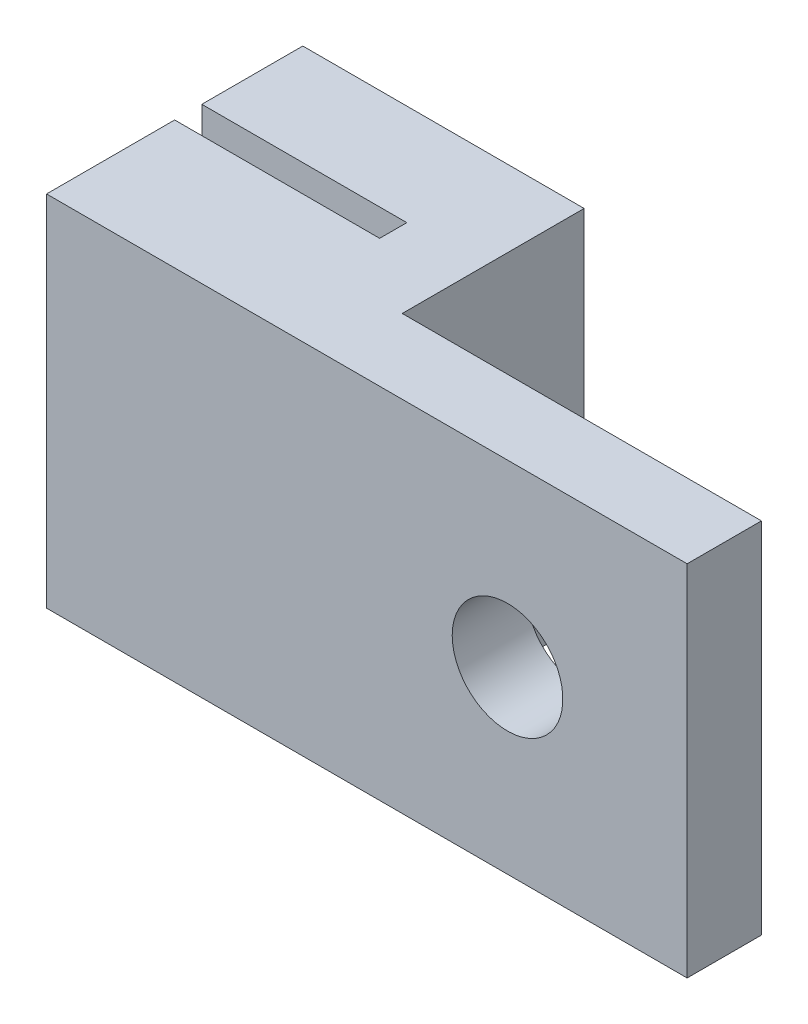
ISO-10303-21;
HEADER;
FILE_DESCRIPTION(('STEP AP214'),'2;1');
FILE_NAME('part.step','',(''),(''),'','','');
FILE_SCHEMA(('AUTOMOTIVE_DESIGN { 1 0 10303 214 1 1 1 1 }'));
ENDSEC;
DATA;
#1=APPLICATION_CONTEXT('core data for automotive mechanical design processes');
#2=APPLICATION_PROTOCOL_DEFINITION('international standard','automotive_design',2000,#1);
#3=PRODUCT_CONTEXT('',#1,'mechanical');
#4=PRODUCT('Part','Part','',(#3));
#5=PRODUCT_RELATED_PRODUCT_CATEGORY('part','',(#4));
#6=PRODUCT_DEFINITION_FORMATION('','',#4);
#7=PRODUCT_DEFINITION_CONTEXT('part definition',#1,'design');
#8=PRODUCT_DEFINITION('design','',#6,#7);
#9=PRODUCT_DEFINITION_SHAPE('','',#8);
#10=(LENGTH_UNIT() NAMED_UNIT(*) SI_UNIT(.MILLI.,.METRE.));
#11=(NAMED_UNIT(*) PLANE_ANGLE_UNIT() SI_UNIT($,.RADIAN.));
#12=(NAMED_UNIT(*) SI_UNIT($,.STERADIAN.) SOLID_ANGLE_UNIT());
#13=UNCERTAINTY_MEASURE_WITH_UNIT(LENGTH_MEASURE(1.E-05),#10,'distance_accuracy_value','');
#14=(GEOMETRIC_REPRESENTATION_CONTEXT(3) GLOBAL_UNCERTAINTY_ASSIGNED_CONTEXT((#13)) GLOBAL_UNIT_ASSIGNED_CONTEXT((#10,
#11,#12)) REPRESENTATION_CONTEXT('',''));
#15=CARTESIAN_POINT('',(0.,0.,0.));
#16=DIRECTION('',(0.,0.,1.));
#17=DIRECTION('',(1.,0.,0.));
#18=AXIS2_PLACEMENT_3D('',#15,#16,#17);
#19=CARTESIAN_POINT('',(0.,-14.,391.676417727354));
#20=DIRECTION('',(0.,0.,1.));
#21=DIRECTION('',(1.,0.,0.));
#22=AXIS2_PLACEMENT_3D('',#19,#20,#21);
#23=PLANE('',#22);
#24=DIRECTION('',(1.,0.,0.));
#25=VECTOR('',#24,1.);
#26=CARTESIAN_POINT('',(0.,0.,391.676417727354));
#27=LINE('',#26,#25);
#28=CARTESIAN_POINT('',(-1237.71012145749,0.,391.676417727354));
#29=VERTEX_POINT('',#28);
#30=CARTESIAN_POINT('',(-1229.71012145749,0.,391.676417727354));
#31=VERTEX_POINT('',#30);
#32=EDGE_CURVE('E141',#29,#31,#27,.T.);
#33=ORIENTED_EDGE('',*,*,#32,.F.);
#34=DIRECTION('',(0.,1.,0.));
#35=VECTOR('',#34,1.);
#36=CARTESIAN_POINT('',(-1237.71012145749,-14.,391.676417727354));
#37=LINE('',#36,#35);
#38=CARTESIAN_POINT('',(-1237.71012145749,-14.,391.676417727354));
#39=VERTEX_POINT('',#38);
#40=EDGE_CURVE('E11',#39,#29,#37,.T.);
#41=ORIENTED_EDGE('',*,*,#40,.F.);
#42=DIRECTION('',(1.,0.,0.));
#43=VECTOR('',#42,1.);
#44=CARTESIAN_POINT('',(0.,-14.,391.676417727354));
#45=LINE('',#44,#43);
#46=CARTESIAN_POINT('',(-1229.71012145749,-14.,391.676417727354));
#47=VERTEX_POINT('',#46);
#48=EDGE_CURVE('E170',#39,#47,#45,.T.);
#49=ORIENTED_EDGE('',*,*,#48,.T.);
#50=DIRECTION('',(0.,1.,0.));
#51=VECTOR('',#50,1.);
#52=CARTESIAN_POINT('',(-1229.71012145749,-14.,391.676417727354));
#53=LINE('',#52,#51);
#54=EDGE_CURVE('E35',#47,#31,#53,.T.);
#55=ORIENTED_EDGE('',*,*,#54,.T.);
#56=EDGE_LOOP('',(#33,#41,#49,#55));
#57=FACE_BOUND('',#56,.T.);
#58=ADVANCED_FACE('F32',(#57),#23,.T.);
#59=CARTESIAN_POINT('',(-1237.71012145749,-14.,0.));
#60=DIRECTION('',(1.,0.,0.));
#61=DIRECTION('',(0.,0.,-1.));
#62=AXIS2_PLACEMENT_3D('',#59,#60,#61);
#63=PLANE('',#62);
#64=DIRECTION('',(0.,0.,-1.));
#65=VECTOR('',#64,1.);
#66=CARTESIAN_POINT('',(-1237.71012145749,0.,0.));
#67=LINE('',#66,#65);
#68=CARTESIAN_POINT('',(-1237.71012145749,0.,387.736417727354));
#69=VERTEX_POINT('',#68);
#70=EDGE_CURVE('E154',#29,#69,#67,.T.);
#71=ORIENTED_EDGE('',*,*,#70,.T.);
#72=DIRECTION('',(0.,1.,0.));
#73=VECTOR('',#72,1.);
#74=CARTESIAN_POINT('',(-1237.71012145749,-14.,387.736417727354));
#75=LINE('',#74,#73);
#76=CARTESIAN_POINT('',(-1237.71012145749,-14.,387.736417727354));
#77=VERTEX_POINT('',#76);
#78=EDGE_CURVE('E40',#77,#69,#75,.T.);
#79=ORIENTED_EDGE('',*,*,#78,.F.);
#80=DIRECTION('',(0.,0.,-1.));
#81=VECTOR('',#80,1.);
#82=CARTESIAN_POINT('',(-1237.71012145749,-14.,0.));
#83=LINE('',#82,#81);
#84=EDGE_CURVE('E137',#39,#77,#83,.T.);
#85=ORIENTED_EDGE('',*,*,#84,.F.);
#86=ORIENTED_EDGE('',*,*,#40,.T.);
#87=EDGE_LOOP('',(#71,#79,#85,#86));
#88=FACE_BOUND('',#87,.T.);
#89=ADVANCED_FACE('F171',(#88),#63,.F.);
#90=CARTESIAN_POINT('',(0.,-14.,387.736417727354));
#91=DIRECTION('',(0.,0.,1.));
#92=DIRECTION('',(1.,0.,0.));
#93=AXIS2_PLACEMENT_3D('',#90,#91,#92);
#94=PLANE('',#93);
#95=DIRECTION('',(1.,0.,0.));
#96=VECTOR('',#95,1.);
#97=CARTESIAN_POINT('',(0.,0.,387.736417727354));
#98=LINE('',#97,#96);
#99=CARTESIAN_POINT('',(-1226.72982017208,0.,387.736417727354));
#100=VERTEX_POINT('',#99);
#101=EDGE_CURVE('E157',#69,#100,#98,.T.);
#102=ORIENTED_EDGE('',*,*,#101,.T.);
#103=DIRECTION('',(0.,1.,0.));
#104=VECTOR('',#103,1.);
#105=CARTESIAN_POINT('',(-1226.72982017208,-14.,387.736417727354));
#106=LINE('',#105,#104);
#107=CARTESIAN_POINT('',(-1226.72982017208,-14.,387.736417727354));
#108=VERTEX_POINT('',#107);
#109=EDGE_CURVE('E145',#108,#100,#106,.T.);
#110=ORIENTED_EDGE('',*,*,#109,.F.);
#111=DIRECTION('',(1.,0.,0.));
#112=VECTOR('',#111,1.);
#113=CARTESIAN_POINT('',(0.,-14.,387.736417727354));
#114=LINE('',#113,#112);
#115=EDGE_CURVE('E129',#77,#108,#114,.T.);
#116=ORIENTED_EDGE('',*,*,#115,.F.);
#117=ORIENTED_EDGE('',*,*,#78,.T.);
#118=EDGE_LOOP('',(#102,#110,#116,#117));
#119=FACE_BOUND('',#118,.T.);
#120=ADVANCED_FACE('F175',(#119),#94,.F.);
#121=CARTESIAN_POINT('',(-1212.71012145749,-14.,0.));
#122=DIRECTION('',(1.,0.,0.));
#123=DIRECTION('',(0.,0.,-1.));
#124=AXIS2_PLACEMENT_3D('',#121,#122,#123);
#125=PLANE('',#124);
#126=DIRECTION('',(0.,1.,0.));
#127=VECTOR('',#126,1.);
#128=CARTESIAN_POINT('',(-1212.71012145749,-14.,394.836001477778));
#129=LINE('',#128,#127);
#130=CARTESIAN_POINT('',(-1212.71012145749,-14.,394.836001477778));
#131=VERTEX_POINT('',#130);
#132=CARTESIAN_POINT('',(-1212.71012145749,0.,394.836001477778));
#133=VERTEX_POINT('',#132);
#134=EDGE_CURVE('E178',#131,#133,#129,.T.);
#135=ORIENTED_EDGE('',*,*,#134,.T.);
#136=DIRECTION('',(0.,0.,-1.));
#137=VECTOR('',#136,1.);
#138=CARTESIAN_POINT('',(-1212.71012145749,0.,0.));
#139=LINE('',#138,#137);
#140=CARTESIAN_POINT('',(-1212.71012145749,0.,397.736417727354));
#141=VERTEX_POINT('',#140);
#142=EDGE_CURVE('E113',#141,#133,#139,.T.);
#143=ORIENTED_EDGE('',*,*,#142,.F.);
#144=DIRECTION('',(0.,1.,0.));
#145=VECTOR('',#144,1.);
#146=CARTESIAN_POINT('',(-1212.71012145749,-14.,397.736417727354));
#147=LINE('',#146,#145);
#148=CARTESIAN_POINT('',(-1212.71012145749,-14.,397.736417727354));
#149=VERTEX_POINT('',#148);
#150=EDGE_CURVE('E106',#149,#141,#147,.T.);
#151=ORIENTED_EDGE('',*,*,#150,.F.);
#152=DIRECTION('',(0.,0.,-1.));
#153=VECTOR('',#152,1.);
#154=CARTESIAN_POINT('',(-1212.71012145749,-14.,0.));
#155=LINE('',#154,#153);
#156=EDGE_CURVE('E111',#149,#131,#155,.T.);
#157=ORIENTED_EDGE('',*,*,#156,.T.);
#158=EDGE_LOOP('',(#135,#143,#151,#157));
#159=FACE_BOUND('',#158,.T.);
#160=ADVANCED_FACE('F109',(#159),#125,.T.);
#161=CARTESIAN_POINT('',(0.,-14.,397.736417727354));
#162=DIRECTION('',(0.,0.,1.));
#163=DIRECTION('',(1.,0.,0.));
#164=AXIS2_PLACEMENT_3D('',#161,#162,#163);
#165=PLANE('',#164);
#166=CARTESIAN_POINT('',(-1219.71997081479,-7.,397.736417727354));
#167=DIRECTION('',(0.,0.,-1.));
#168=DIRECTION('',(-1.,0.,0.));
#169=AXIS2_PLACEMENT_3D('',#166,#167,#168);
#170=CIRCLE('',#169,2.15899999999997);
#171=CARTESIAN_POINT('',(-1221.87897081479,-7.,397.736417727354));
#172=VERTEX_POINT('',#171);
#173=EDGE_CURVE('E214',#172,#172,#170,.T.);
#174=ORIENTED_EDGE('',*,*,#173,.T.);
#175=EDGE_LOOP('',(#174));
#176=FACE_BOUND('',#175,.T.);
#177=DIRECTION('',(1.,0.,0.));
#178=VECTOR('',#177,1.);
#179=CARTESIAN_POINT('',(0.,0.,397.736417727354));
#180=LINE('',#179,#178);
#181=CARTESIAN_POINT('',(-1237.71012145749,0.,397.736417727354));
#182=VERTEX_POINT('',#181);
#183=EDGE_CURVE('E153',#182,#141,#180,.T.);
#184=ORIENTED_EDGE('',*,*,#183,.F.);
#185=DIRECTION('',(0.,1.,0.));
#186=VECTOR('',#185,1.);
#187=CARTESIAN_POINT('',(-1237.71012145749,-14.,397.736417727354));
#188=LINE('',#187,#186);
#189=CARTESIAN_POINT('',(-1237.71012145749,-14.,397.736417727354));
#190=VERTEX_POINT('',#189);
#191=EDGE_CURVE('E118',#190,#182,#188,.T.);
#192=ORIENTED_EDGE('',*,*,#191,.F.);
#193=DIRECTION('',(1.,0.,0.));
#194=VECTOR('',#193,1.);
#195=CARTESIAN_POINT('',(0.,-14.,397.736417727354));
#196=LINE('',#195,#194);
#197=EDGE_CURVE('E125',#190,#149,#196,.T.);
#198=ORIENTED_EDGE('',*,*,#197,.T.);
#199=ORIENTED_EDGE('',*,*,#150,.T.);
#200=EDGE_LOOP('',(#184,#192,#198,#199));
#201=FACE_BOUND('',#200,.T.);
#202=ADVANCED_FACE('F131',(#176,#201),#165,.T.);
#203=CARTESIAN_POINT('',(-1237.71012145749,0.,392.736417727354));
#204=VERTEX_POINT('',#203);
#205=EDGE_CURVE('E151',#182,#204,#67,.T.);
#206=ORIENTED_EDGE('',*,*,#205,.T.);
#207=DIRECTION('',(0.,1.,0.));
#208=VECTOR('',#207,1.);
#209=CARTESIAN_POINT('',(-1237.71012145749,-14.,392.736417727354));
#210=LINE('',#209,#208);
#211=CARTESIAN_POINT('',(-1237.71012145749,-14.,392.736417727354));
#212=VERTEX_POINT('',#211);
#213=EDGE_CURVE('E163',#212,#204,#210,.T.);
#214=ORIENTED_EDGE('',*,*,#213,.F.);
#215=EDGE_CURVE('E133',#190,#212,#83,.T.);
#216=ORIENTED_EDGE('',*,*,#215,.F.);
#217=ORIENTED_EDGE('',*,*,#191,.T.);
#218=EDGE_LOOP('',(#206,#214,#216,#217));
#219=FACE_BOUND('',#218,.T.);
#220=ADVANCED_FACE('F202',(#219),#63,.F.);
#221=CARTESIAN_POINT('',(0.,-14.,392.736417727354));
#222=DIRECTION('',(0.,0.,1.));
#223=DIRECTION('',(1.,0.,0.));
#224=AXIS2_PLACEMENT_3D('',#221,#222,#223);
#225=PLANE('',#224);
#226=DIRECTION('',(1.,0.,0.));
#227=VECTOR('',#226,1.);
#228=CARTESIAN_POINT('',(0.,0.,392.736417727354));
#229=LINE('',#228,#227);
#230=CARTESIAN_POINT('',(-1229.71012145749,0.,392.736417727354));
#231=VERTEX_POINT('',#230);
#232=EDGE_CURVE('E148',#204,#231,#229,.T.);
#233=ORIENTED_EDGE('',*,*,#232,.T.);
#234=DIRECTION('',(0.,1.,0.));
#235=VECTOR('',#234,1.);
#236=CARTESIAN_POINT('',(-1229.71012145749,-14.,392.736417727354));
#237=LINE('',#236,#235);
#238=CARTESIAN_POINT('',(-1229.71012145749,-14.,392.736417727354));
#239=VERTEX_POINT('',#238);
#240=EDGE_CURVE('E165',#239,#231,#237,.T.);
#241=ORIENTED_EDGE('',*,*,#240,.F.);
#242=DIRECTION('',(1.,0.,0.));
#243=VECTOR('',#242,1.);
#244=CARTESIAN_POINT('',(0.,-14.,392.736417727354));
#245=LINE('',#244,#243);
#246=EDGE_CURVE('E135',#212,#239,#245,.T.);
#247=ORIENTED_EDGE('',*,*,#246,.F.);
#248=ORIENTED_EDGE('',*,*,#213,.T.);
#249=EDGE_LOOP('',(#233,#241,#247,#248));
#250=FACE_BOUND('',#249,.T.);
#251=ADVANCED_FACE('F192',(#250),#225,.F.);
#252=CARTESIAN_POINT('',(-1229.71012145749,-14.,0.));
#253=DIRECTION('',(-1.,0.,0.));
#254=DIRECTION('',(0.,0.,1.));
#255=AXIS2_PLACEMENT_3D('',#252,#253,#254);
#256=PLANE('',#255);
#257=DIRECTION('',(0.,0.,1.));
#258=VECTOR('',#257,1.);
#259=CARTESIAN_POINT('',(-1229.71012145749,0.,0.));
#260=LINE('',#259,#258);
#261=EDGE_CURVE('E144',#31,#231,#260,.T.);
#262=ORIENTED_EDGE('',*,*,#261,.F.);
#263=ORIENTED_EDGE('',*,*,#54,.F.);
#264=DIRECTION('',(0.,0.,1.));
#265=VECTOR('',#264,1.);
#266=CARTESIAN_POINT('',(-1229.71012145749,-14.,0.));
#267=LINE('',#266,#265);
#268=EDGE_CURVE('E188',#47,#239,#267,.T.);
#269=ORIENTED_EDGE('',*,*,#268,.T.);
#270=ORIENTED_EDGE('',*,*,#240,.T.);
#271=EDGE_LOOP('',(#262,#263,#269,#270));
#272=FACE_BOUND('',#271,.T.);
#273=ADVANCED_FACE('F194',(#272),#256,.T.);
#274=CARTESIAN_POINT('',(0.,-14.,0.));
#275=DIRECTION('',(0.,1.,0.));
#276=DIRECTION('',(0.,0.,1.));
#277=AXIS2_PLACEMENT_3D('',#274,#275,#276);
#278=PLANE('',#277);
#279=ORIENTED_EDGE('',*,*,#115,.T.);
#280=DIRECTION('',(0.,0.,1.));
#281=VECTOR('',#280,1.);
#282=CARTESIAN_POINT('',(-1226.72982017208,-14.,387.736417727354));
#283=LINE('',#282,#281);
#284=CARTESIAN_POINT('',(-1226.72982017208,-14.,394.836001477778));
#285=VERTEX_POINT('',#284);
#286=EDGE_CURVE('E215',#108,#285,#283,.T.);
#287=ORIENTED_EDGE('',*,*,#286,.T.);
#288=DIRECTION('',(1.,0.,0.));
#289=VECTOR('',#288,1.);
#290=CARTESIAN_POINT('',(-1226.72982017208,-14.,394.836001477778));
#291=LINE('',#290,#289);
#292=EDGE_CURVE('E128',#285,#131,#291,.T.);
#293=ORIENTED_EDGE('',*,*,#292,.T.);
#294=ORIENTED_EDGE('',*,*,#156,.F.);
#295=ORIENTED_EDGE('',*,*,#197,.F.);
#296=ORIENTED_EDGE('',*,*,#215,.T.);
#297=ORIENTED_EDGE('',*,*,#246,.T.);
#298=ORIENTED_EDGE('',*,*,#268,.F.);
#299=ORIENTED_EDGE('',*,*,#48,.F.);
#300=ORIENTED_EDGE('',*,*,#84,.T.);
#301=EDGE_LOOP('',(#279,#287,#293,#294,#295,#296,#297,#298,#299,#300));
#302=FACE_BOUND('',#301,.T.);
#303=ADVANCED_FACE('F124',(#302),#278,.F.);
#304=CARTESIAN_POINT('',(0.,0.,0.));
#305=DIRECTION('',(0.,1.,0.));
#306=DIRECTION('',(0.,0.,1.));
#307=AXIS2_PLACEMENT_3D('',#304,#305,#306);
#308=PLANE('',#307);
#309=DIRECTION('',(0.,0.,1.));
#310=VECTOR('',#309,1.);
#311=CARTESIAN_POINT('',(-1226.72982017208,0.,387.736417727354));
#312=LINE('',#311,#310);
#313=CARTESIAN_POINT('',(-1226.72982017208,0.,394.836001477778));
#314=VERTEX_POINT('',#313);
#315=EDGE_CURVE('E48',#100,#314,#312,.T.);
#316=ORIENTED_EDGE('',*,*,#315,.F.);
#317=ORIENTED_EDGE('',*,*,#101,.F.);
#318=ORIENTED_EDGE('',*,*,#70,.F.);
#319=ORIENTED_EDGE('',*,*,#32,.T.);
#320=ORIENTED_EDGE('',*,*,#261,.T.);
#321=ORIENTED_EDGE('',*,*,#232,.F.);
#322=ORIENTED_EDGE('',*,*,#205,.F.);
#323=ORIENTED_EDGE('',*,*,#183,.T.);
#324=ORIENTED_EDGE('',*,*,#142,.T.);
#325=DIRECTION('',(1.,0.,0.));
#326=VECTOR('',#325,1.);
#327=CARTESIAN_POINT('',(-1226.72982017208,0.,394.836001477778));
#328=LINE('',#327,#326);
#329=EDGE_CURVE('E183',#314,#133,#328,.T.);
#330=ORIENTED_EDGE('',*,*,#329,.F.);
#331=EDGE_LOOP('',(#316,#317,#318,#319,#320,#321,#322,#323,#324,#330));
#332=FACE_BOUND('',#331,.T.);
#333=ADVANCED_FACE('F200',(#332),#308,.T.);
#334=CARTESIAN_POINT('',(-1226.72982017208,-14.,387.736417727354));
#335=DIRECTION('',(-1.,0.,0.));
#336=DIRECTION('',(0.,0.,1.));
#337=AXIS2_PLACEMENT_3D('',#334,#335,#336);
#338=PLANE('',#337);
#339=ORIENTED_EDGE('',*,*,#315,.T.);
#340=DIRECTION('',(0.,1.,0.));
#341=VECTOR('',#340,1.);
#342=CARTESIAN_POINT('',(-1226.72982017208,-14.,394.836001477778));
#343=LINE('',#342,#341);
#344=EDGE_CURVE('E180',#285,#314,#343,.T.);
#345=ORIENTED_EDGE('',*,*,#344,.F.);
#346=ORIENTED_EDGE('',*,*,#286,.F.);
#347=ORIENTED_EDGE('',*,*,#109,.T.);
#348=EDGE_LOOP('',(#339,#345,#346,#347));
#349=FACE_BOUND('',#348,.T.);
#350=ADVANCED_FACE('F230',(#349),#338,.F.);
#351=CARTESIAN_POINT('',(-1226.72982017208,-14.,394.836001477778));
#352=DIRECTION('',(0.,0.,1.));
#353=DIRECTION('',(1.,0.,0.));
#354=AXIS2_PLACEMENT_3D('',#351,#352,#353);
#355=PLANE('',#354);
#356=CARTESIAN_POINT('',(-1219.71997081479,-7.,394.836001477778));
#357=DIRECTION('',(0.,0.,-1.));
#358=DIRECTION('',(-1.,0.,0.));
#359=AXIS2_PLACEMENT_3D('',#356,#357,#358);
#360=CIRCLE('',#359,2.15899999999997);
#361=CARTESIAN_POINT('',(-1221.87897081479,-7.,394.836001477778));
#362=VERTEX_POINT('',#361);
#363=EDGE_CURVE('E217',#362,#362,#360,.T.);
#364=ORIENTED_EDGE('',*,*,#363,.F.);
#365=EDGE_LOOP('',(#364));
#366=FACE_BOUND('',#365,.T.);
#367=ORIENTED_EDGE('',*,*,#329,.T.);
#368=ORIENTED_EDGE('',*,*,#134,.F.);
#369=ORIENTED_EDGE('',*,*,#292,.F.);
#370=ORIENTED_EDGE('',*,*,#344,.T.);
#371=EDGE_LOOP('',(#367,#368,#369,#370));
#372=FACE_BOUND('',#371,.T.);
#373=ADVANCED_FACE('F227',(#366,#372),#355,.F.);
#374=CARTESIAN_POINT('',(-1219.71997081479,-7.,397.736417727354));
#375=DIRECTION('',(0.,0.,-1.));
#376=DIRECTION('',(-1.,0.,0.));
#377=AXIS2_PLACEMENT_3D('',#374,#375,#376);
#378=CYLINDRICAL_SURFACE('',#377,2.15899999999997);
#379=CARTESIAN_POINT('',(-1221.87897081479,-7.,397.736417727354));
#380=CARTESIAN_POINT('',(-1221.87897081479,-7.,397.706205058087));
#381=CARTESIAN_POINT('',(-1221.87897081479,-7.,397.675992388821));
#382=CARTESIAN_POINT('',(-1221.87897081479,-7.,397.615567050288));
#383=CARTESIAN_POINT('',(-1221.87897081479,-7.,397.585354381021));
#384=CARTESIAN_POINT('',(-1221.87897081479,-7.,397.524929042489));
#385=CARTESIAN_POINT('',(-1221.87897081479,-7.,397.494716373222));
#386=CARTESIAN_POINT('',(-1221.87897081479,-7.,397.434291034689));
#387=CARTESIAN_POINT('',(-1221.87897081479,-7.,397.404078365423));
#388=CARTESIAN_POINT('',(-1221.87897081479,-7.,397.34365302689));
#389=CARTESIAN_POINT('',(-1221.87897081479,-7.,397.313440357624));
#390=CARTESIAN_POINT('',(-1221.87897081479,-7.,397.253015019091));
#391=CARTESIAN_POINT('',(-1221.87897081479,-7.,397.222802349824));
#392=CARTESIAN_POINT('',(-1221.87897081479,-7.,397.162377011292));
#393=CARTESIAN_POINT('',(-1221.87897081479,-7.,397.132164342025));
#394=CARTESIAN_POINT('',(-1221.87897081479,-7.,397.071739003492));
#395=CARTESIAN_POINT('',(-1221.87897081479,-7.,397.041526334226));
#396=CARTESIAN_POINT('',(-1221.87897081479,-7.,396.981100995693));
#397=CARTESIAN_POINT('',(-1221.87897081479,-7.,396.950888326427));
#398=CARTESIAN_POINT('',(-1221.87897081479,-7.,396.890462987894));
#399=CARTESIAN_POINT('',(-1221.87897081479,-7.,396.860250318627));
#400=CARTESIAN_POINT('',(-1221.87897081479,-7.,396.799824980095));
#401=CARTESIAN_POINT('',(-1221.87897081479,-7.,396.769612310828));
#402=CARTESIAN_POINT('',(-1221.87897081479,-7.,396.709186972295));
#403=CARTESIAN_POINT('',(-1221.87897081479,-7.,396.678974303029));
#404=CARTESIAN_POINT('',(-1221.87897081479,-7.,396.618548964496));
#405=CARTESIAN_POINT('',(-1221.87897081479,-7.,396.58833629523));
#406=CARTESIAN_POINT('',(-1221.87897081479,-7.,396.527910956697));
#407=CARTESIAN_POINT('',(-1221.87897081479,-7.,396.49769828743));
#408=CARTESIAN_POINT('',(-1221.87897081479,-7.,396.437272948898));
#409=CARTESIAN_POINT('',(-1221.87897081479,-7.,396.407060279631));
#410=CARTESIAN_POINT('',(-1221.87897081479,-7.,396.346634941098));
#411=CARTESIAN_POINT('',(-1221.87897081479,-7.,396.316422271832));
#412=CARTESIAN_POINT('',(-1221.87897081479,-7.,396.255996933299));
#413=CARTESIAN_POINT('',(-1221.87897081479,-7.,396.225784264033));
#414=CARTESIAN_POINT('',(-1221.87897081479,-7.,396.1653589255));
#415=CARTESIAN_POINT('',(-1221.87897081479,-7.,396.135146256233));
#416=CARTESIAN_POINT('',(-1221.87897081479,-7.,396.074720917701));
#417=CARTESIAN_POINT('',(-1221.87897081479,-7.,396.044508248434));
#418=CARTESIAN_POINT('',(-1221.87897081479,-7.,395.984082909901));
#419=CARTESIAN_POINT('',(-1221.87897081479,-7.,395.953870240635));
#420=CARTESIAN_POINT('',(-1221.87897081479,-7.,395.893444902102));
#421=CARTESIAN_POINT('',(-1221.87897081479,-7.,395.863232232836));
#422=CARTESIAN_POINT('',(-1221.87897081479,-7.,395.802806894303));
#423=CARTESIAN_POINT('',(-1221.87897081479,-7.,395.772594225037));
#424=CARTESIAN_POINT('',(-1221.87897081479,-7.,395.712168886504));
#425=CARTESIAN_POINT('',(-1221.87897081479,-7.,395.681956217237));
#426=CARTESIAN_POINT('',(-1221.87897081479,-7.,395.621530878704));
#427=CARTESIAN_POINT('',(-1221.87897081479,-7.,395.591318209438));
#428=CARTESIAN_POINT('',(-1221.87897081479,-7.,395.530892870905));
#429=CARTESIAN_POINT('',(-1221.87897081479,-7.,395.500680201639));
#430=CARTESIAN_POINT('',(-1221.87897081479,-7.,395.440254863106));
#431=CARTESIAN_POINT('',(-1221.87897081479,-7.,395.41004219384));
#432=CARTESIAN_POINT('',(-1221.87897081479,-7.,395.349616855307));
#433=CARTESIAN_POINT('',(-1221.87897081479,-7.,395.31940418604));
#434=CARTESIAN_POINT('',(-1221.87897081479,-7.,395.258978847507));
#435=CARTESIAN_POINT('',(-1221.87897081479,-7.,395.228766178241));
#436=CARTESIAN_POINT('',(-1221.87897081479,-7.,395.168340839708));
#437=CARTESIAN_POINT('',(-1221.87897081479,-7.,395.138128170442));
#438=CARTESIAN_POINT('',(-1221.87897081479,-7.,395.077702831909));
#439=CARTESIAN_POINT('',(-1221.87897081479,-7.,395.047490162643));
#440=CARTESIAN_POINT('',(-1221.87897081479,-7.,394.98706482411));
#441=CARTESIAN_POINT('',(-1221.87897081479,-7.,394.956852154843));
#442=CARTESIAN_POINT('',(-1221.87897081479,-7.,394.89642681631));
#443=CARTESIAN_POINT('',(-1221.87897081479,-7.,394.866214147044));
#444=CARTESIAN_POINT('',(-1221.87897081479,-7.,394.836001477778));
#445=B_SPLINE_CURVE_WITH_KNOTS('',3,(#379,#380,#381,#382,#383,#384,#385,#386,#387,#388,#389,
#390,#391,#392,#393,#394,#395,#396,#397,#398,#399,#400,#401,#402,#403,#404,#405,#406,#407,#408,
#409,#410,#411,#412,#413,#414,#415,#416,#417,#418,#419,#420,#421,#422,#423,#424,#425,#426,#427,
#428,#429,#430,#431,#432,#433,#434,#435,#436,#437,#438,#439,#440,#441,#442,#443,#444),
.UNSPECIFIED.,.F.,.F.,(4,2,2,2,2,2,2,2,2,2,2,2,2,2,2,2,2,2,2,2,2,2,2,2,2,2,2,2,2,2,2,2,4),(0.,
0.0906380077992375,0.181276015598475,0.271914023397712,0.36255203119695,0.453190038996187,
0.54382804679548,0.634466054594718,0.725104062393955,0.815742070193193,0.90638007799243,
0.997018085791723,1.08765609359096,1.1782941013902,1.26893210918944,1.35957011698867,
1.45020812478797,1.5408461325872,1.63148414038644,1.72212214818568,1.81276015598492,
1.90339816378415,1.99403617158345,2.08467417938268,2.17531218718192,2.26595019498116,
2.3565882027804,2.44722621057969,2.53786421837893,2.62850222617816,2.7191402339774,
2.80977824177664,2.90041624957593),.UNSPECIFIED.);
#446=EDGE_CURVE('BSEAM225',#172,#362,#445,.T.);
#447=ORIENTED_EDGE('',*,*,#173,.F.);
#448=ORIENTED_EDGE('',*,*,#363,.T.);
#449=ORIENTED_EDGE('',*,*,#446,.T.);
#450=ORIENTED_EDGE('',*,*,#446,.F.);
#451=EDGE_LOOP('',(#447,#449,#448,#450));
#452=FACE_BOUND('',#451,.T.);
#453=ADVANCED_FACE('F225',(#452),#378,.F.);
#454=CLOSED_SHELL('',(#58,#89,#120,#160,#202,#220,#251,#273,#303,#333,#350,#373,#453));
#455=MANIFOLD_SOLID_BREP('B2',#454);
#456=ADVANCED_BREP_SHAPE_REPRESENTATION('',(#18,#455),#14);
#457=SHAPE_DEFINITION_REPRESENTATION(#9,#456);
ENDSEC;
END-ISO-10303-21;
